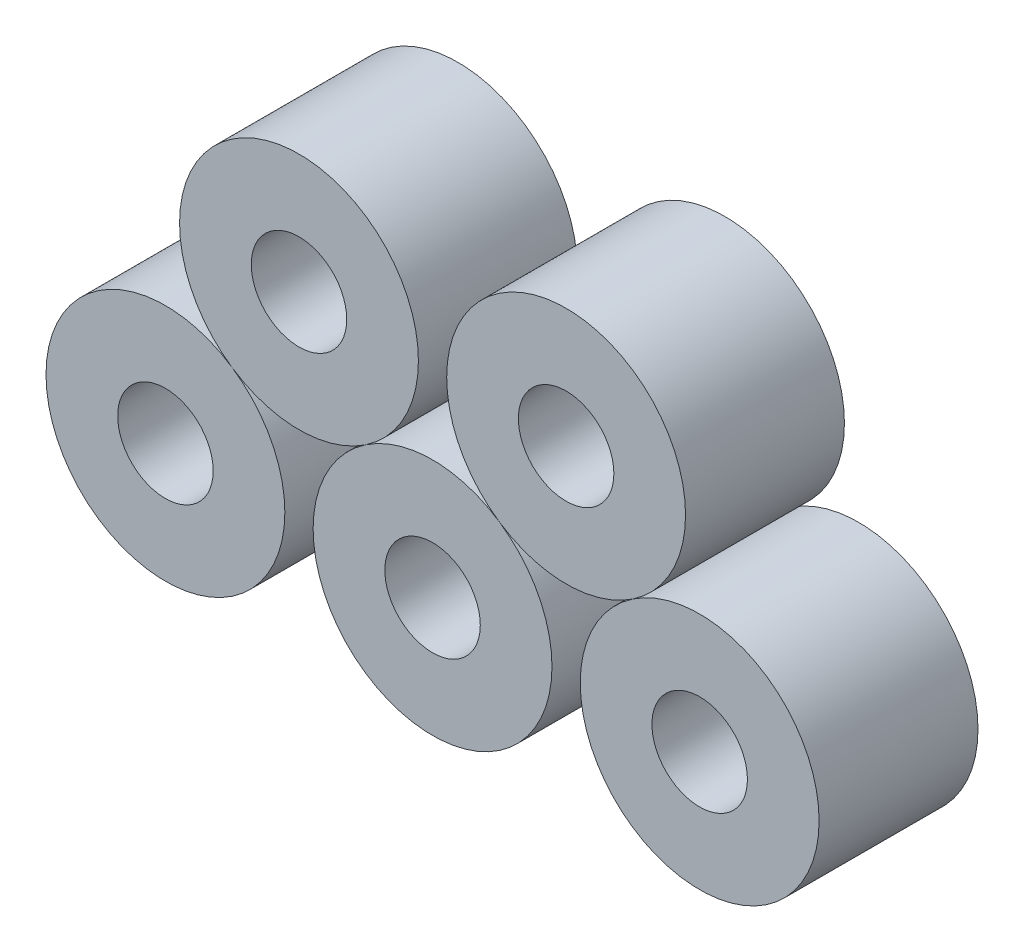
ISO-10303-21;
HEADER;
FILE_DESCRIPTION(('STEP AP214'),'2;1');
FILE_NAME('part.step','',(''),(''),'','','');
FILE_SCHEMA(('AUTOMOTIVE_DESIGN { 1 0 10303 214 1 1 1 1 }'));
ENDSEC;
DATA;
#1=APPLICATION_CONTEXT('core data for automotive mechanical design processes');
#2=APPLICATION_PROTOCOL_DEFINITION('international standard','automotive_design',2000,#1);
#3=PRODUCT_CONTEXT('',#1,'mechanical');
#4=PRODUCT('Part','Part','',(#3));
#5=PRODUCT_RELATED_PRODUCT_CATEGORY('part','',(#4));
#6=PRODUCT_DEFINITION_FORMATION('','',#4);
#7=PRODUCT_DEFINITION_CONTEXT('part definition',#1,'design');
#8=PRODUCT_DEFINITION('design','',#6,#7);
#9=PRODUCT_DEFINITION_SHAPE('','',#8);
#10=(LENGTH_UNIT() NAMED_UNIT(*) SI_UNIT(.MILLI.,.METRE.));
#11=(NAMED_UNIT(*) PLANE_ANGLE_UNIT() SI_UNIT($,.RADIAN.));
#12=(NAMED_UNIT(*) SI_UNIT($,.STERADIAN.) SOLID_ANGLE_UNIT());
#13=UNCERTAINTY_MEASURE_WITH_UNIT(LENGTH_MEASURE(1.E-05),#10,'distance_accuracy_value','');
#14=(GEOMETRIC_REPRESENTATION_CONTEXT(3) GLOBAL_UNCERTAINTY_ASSIGNED_CONTEXT((#13)) GLOBAL_UNIT_ASSIGNED_CONTEXT((#10,
#11,#12)) REPRESENTATION_CONTEXT('',''));
#15=CARTESIAN_POINT('',(0.,0.,0.));
#16=DIRECTION('',(0.,0.,1.));
#17=DIRECTION('',(1.,0.,0.));
#18=AXIS2_PLACEMENT_3D('',#15,#16,#17);
#19=CARTESIAN_POINT('',(0.,0.,1268.));
#20=DIRECTION('',(0.,0.,1.));
#21=DIRECTION('',(1.,0.,0.));
#22=AXIS2_PLACEMENT_3D('',#19,#20,#21);
#23=PLANE('',#22);
#24=CARTESIAN_POINT('',(0.,0.,1268.));
#25=DIRECTION('',(0.,0.,1.));
#26=DIRECTION('',(1.,0.,0.));
#27=AXIS2_PLACEMENT_3D('',#24,#25,#26);
#28=CIRCLE('',#27,953.);
#29=CARTESIAN_POINT('',(953.,0.,1268.));
#30=VERTEX_POINT('',#29);
#31=EDGE_CURVE('E112',#30,#30,#28,.T.);
#32=ORIENTED_EDGE('',*,*,#31,.T.);
#33=EDGE_LOOP('',(#32));
#34=FACE_BOUND('',#33,.T.);
#35=CARTESIAN_POINT('',(0.,0.,1268.));
#36=DIRECTION('',(0.,0.,1.));
#37=DIRECTION('',(1.,0.,0.));
#38=AXIS2_PLACEMENT_3D('',#35,#36,#37);
#39=CIRCLE('',#38,381.);
#40=CARTESIAN_POINT('',(381.,0.,1268.));
#41=VERTEX_POINT('',#40);
#42=EDGE_CURVE('E103',#41,#41,#39,.T.);
#43=ORIENTED_EDGE('',*,*,#42,.F.);
#44=EDGE_LOOP('',(#43));
#45=FACE_BOUND('',#44,.T.);
#46=ADVANCED_FACE('F99',(#34,#45),#23,.T.);
#47=CARTESIAN_POINT('',(0.,0.,0.));
#48=DIRECTION('',(0.,0.,1.));
#49=DIRECTION('',(1.,0.,0.));
#50=AXIS2_PLACEMENT_3D('',#47,#48,#49);
#51=PLANE('',#50);
#52=CARTESIAN_POINT('',(0.,0.,0.));
#53=DIRECTION('',(0.,0.,1.));
#54=DIRECTION('',(1.,0.,0.));
#55=AXIS2_PLACEMENT_3D('',#52,#53,#54);
#56=CIRCLE('',#55,953.);
#57=CARTESIAN_POINT('',(953.,0.,0.));
#58=VERTEX_POINT('',#57);
#59=EDGE_CURVE('E110',#58,#58,#56,.T.);
#60=ORIENTED_EDGE('',*,*,#59,.F.);
#61=EDGE_LOOP('',(#60));
#62=FACE_BOUND('',#61,.T.);
#63=CARTESIAN_POINT('',(0.,0.,0.));
#64=DIRECTION('',(0.,0.,1.));
#65=DIRECTION('',(1.,0.,0.));
#66=AXIS2_PLACEMENT_3D('',#63,#64,#65);
#67=CIRCLE('',#66,381.);
#68=CARTESIAN_POINT('',(381.,0.,0.));
#69=VERTEX_POINT('',#68);
#70=EDGE_CURVE('E12',#69,#69,#67,.T.);
#71=ORIENTED_EDGE('',*,*,#70,.T.);
#72=EDGE_LOOP('',(#71));
#73=FACE_BOUND('',#72,.T.);
#74=ADVANCED_FACE('F121',(#62,#73),#51,.F.);
#75=CARTESIAN_POINT('',(0.,0.,1268.));
#76=DIRECTION('',(0.,0.,-1.));
#77=DIRECTION('',(-1.,0.,0.));
#78=AXIS2_PLACEMENT_3D('',#75,#76,#77);
#79=CYLINDRICAL_SURFACE('',#78,953.);
#80=ORIENTED_EDGE('',*,*,#59,.T.);
#81=EDGE_LOOP('',(#80));
#82=FACE_BOUND('',#81,.T.);
#83=ORIENTED_EDGE('',*,*,#31,.F.);
#84=EDGE_LOOP('',(#83));
#85=FACE_BOUND('',#84,.T.);
#86=ADVANCED_FACE('F118',(#82,#85),#79,.T.);
#87=CARTESIAN_POINT('',(0.,0.,1268.));
#88=DIRECTION('',(0.,0.,-1.));
#89=DIRECTION('',(-1.,0.,0.));
#90=AXIS2_PLACEMENT_3D('',#87,#88,#89);
#91=CYLINDRICAL_SURFACE('',#90,381.);
#92=ORIENTED_EDGE('',*,*,#42,.T.);
#93=EDGE_LOOP('',(#92));
#94=FACE_BOUND('',#93,.T.);
#95=ORIENTED_EDGE('',*,*,#70,.F.);
#96=EDGE_LOOP('',(#95));
#97=FACE_BOUND('',#96,.T.);
#98=ADVANCED_FACE('F101',(#94,#97),#91,.F.);
#99=CLOSED_SHELL('',(#46,#74,#86,#98));
#100=MANIFOLD_SOLID_BREP('B2',#99);
#101=CARTESIAN_POINT('',(1065.82167401524,1580.14561328991,1268.));
#102=DIRECTION('',(0.,0.,-1.));
#103=DIRECTION('',(-1.,0.,0.));
#104=AXIS2_PLACEMENT_3D('',#101,#102,#103);
#105=CYLINDRICAL_SURFACE('',#104,953.);
#106=CARTESIAN_POINT('',(1065.82167401524,1580.14561328991,0.));
#107=DIRECTION('',(0.,0.,1.));
#108=DIRECTION('',(1.,0.,0.));
#109=AXIS2_PLACEMENT_3D('',#106,#107,#108);
#110=CIRCLE('',#109,953.);
#111=CARTESIAN_POINT('',(2018.82167401524,1580.14561328991,0.));
#112=VERTEX_POINT('',#111);
#113=EDGE_CURVE('E179',#112,#112,#110,.T.);
#114=ORIENTED_EDGE('',*,*,#113,.T.);
#115=EDGE_LOOP('',(#114));
#116=FACE_BOUND('',#115,.T.);
#117=CARTESIAN_POINT('',(1065.82167401524,1580.14561328991,1268.));
#118=DIRECTION('',(0.,0.,1.));
#119=DIRECTION('',(1.,0.,0.));
#120=AXIS2_PLACEMENT_3D('',#117,#118,#119);
#121=CIRCLE('',#120,953.);
#122=CARTESIAN_POINT('',(2018.82167401524,1580.14561328991,1268.));
#123=VERTEX_POINT('',#122);
#124=EDGE_CURVE('E181',#123,#123,#121,.T.);
#125=ORIENTED_EDGE('',*,*,#124,.F.);
#126=EDGE_LOOP('',(#125));
#127=FACE_BOUND('',#126,.T.);
#128=ADVANCED_FACE('F168',(#116,#127),#105,.T.);
#129=CARTESIAN_POINT('',(1065.82167401524,1580.14561328991,1268.));
#130=DIRECTION('',(0.,0.,1.));
#131=DIRECTION('',(1.,0.,0.));
#132=AXIS2_PLACEMENT_3D('',#129,#130,#131);
#133=PLANE('',#132);
#134=ORIENTED_EDGE('',*,*,#124,.T.);
#135=EDGE_LOOP('',(#134));
#136=FACE_BOUND('',#135,.T.);
#137=CARTESIAN_POINT('',(1065.82167401524,1580.14561328991,1268.));
#138=DIRECTION('',(0.,0.,1.));
#139=DIRECTION('',(1.,0.,0.));
#140=AXIS2_PLACEMENT_3D('',#137,#138,#139);
#141=CIRCLE('',#140,381.);
#142=CARTESIAN_POINT('',(1446.82167401524,1580.14561328991,1268.));
#143=VERTEX_POINT('',#142);
#144=EDGE_CURVE('E172',#143,#143,#141,.T.);
#145=ORIENTED_EDGE('',*,*,#144,.F.);
#146=EDGE_LOOP('',(#145));
#147=FACE_BOUND('',#146,.T.);
#148=ADVANCED_FACE('F191',(#136,#147),#133,.T.);
#149=CARTESIAN_POINT('',(1065.82167401524,1580.14561328991,0.));
#150=DIRECTION('',(0.,0.,1.));
#151=DIRECTION('',(1.,0.,0.));
#152=AXIS2_PLACEMENT_3D('',#149,#150,#151);
#153=PLANE('',#152);
#154=ORIENTED_EDGE('',*,*,#113,.F.);
#155=EDGE_LOOP('',(#154));
#156=FACE_BOUND('',#155,.T.);
#157=CARTESIAN_POINT('',(1065.82167401524,1580.14561328991,0.));
#158=DIRECTION('',(0.,0.,1.));
#159=DIRECTION('',(1.,0.,0.));
#160=AXIS2_PLACEMENT_3D('',#157,#158,#159);
#161=CIRCLE('',#160,381.);
#162=CARTESIAN_POINT('',(1446.82167401524,1580.14561328991,0.));
#163=VERTEX_POINT('',#162);
#164=EDGE_CURVE('E98',#163,#163,#161,.T.);
#165=ORIENTED_EDGE('',*,*,#164,.T.);
#166=EDGE_LOOP('',(#165));
#167=FACE_BOUND('',#166,.T.);
#168=ADVANCED_FACE('F189',(#156,#167),#153,.F.);
#169=CARTESIAN_POINT('',(1065.82167401524,1580.14561328991,1268.));
#170=DIRECTION('',(0.,0.,-1.));
#171=DIRECTION('',(-1.,0.,0.));
#172=AXIS2_PLACEMENT_3D('',#169,#170,#171);
#173=CYLINDRICAL_SURFACE('',#172,381.);
#174=ORIENTED_EDGE('',*,*,#144,.T.);
#175=EDGE_LOOP('',(#174));
#176=FACE_BOUND('',#175,.T.);
#177=ORIENTED_EDGE('',*,*,#164,.F.);
#178=EDGE_LOOP('',(#177));
#179=FACE_BOUND('',#178,.T.);
#180=ADVANCED_FACE('F170',(#176,#179),#173,.F.);
#181=CLOSED_SHELL('',(#128,#148,#168,#180));
#182=MANIFOLD_SOLID_BREP('B7',#181);
#183=CARTESIAN_POINT('',(2131.64334803048,0.,1268.));
#184=DIRECTION('',(0.,0.,-1.));
#185=DIRECTION('',(-1.,0.,0.));
#186=AXIS2_PLACEMENT_3D('',#183,#184,#185);
#187=CYLINDRICAL_SURFACE('',#186,953.);
#188=CARTESIAN_POINT('',(2131.64334803048,0.,0.));
#189=DIRECTION('',(0.,0.,1.));
#190=DIRECTION('',(1.,0.,0.));
#191=AXIS2_PLACEMENT_3D('',#188,#189,#190);
#192=CIRCLE('',#191,953.);
#193=CARTESIAN_POINT('',(3084.64334803048,0.,0.));
#194=VERTEX_POINT('',#193);
#195=EDGE_CURVE('E248',#194,#194,#192,.T.);
#196=ORIENTED_EDGE('',*,*,#195,.T.);
#197=EDGE_LOOP('',(#196));
#198=FACE_BOUND('',#197,.T.);
#199=CARTESIAN_POINT('',(2131.64334803048,0.,1268.));
#200=DIRECTION('',(0.,0.,1.));
#201=DIRECTION('',(1.,0.,0.));
#202=AXIS2_PLACEMENT_3D('',#199,#200,#201);
#203=CIRCLE('',#202,953.);
#204=CARTESIAN_POINT('',(3084.64334803048,0.,1268.));
#205=VERTEX_POINT('',#204);
#206=EDGE_CURVE('E250',#205,#205,#203,.T.);
#207=ORIENTED_EDGE('',*,*,#206,.F.);
#208=EDGE_LOOP('',(#207));
#209=FACE_BOUND('',#208,.T.);
#210=ADVANCED_FACE('F237',(#198,#209),#187,.T.);
#211=CARTESIAN_POINT('',(2131.64334803048,0.,1268.));
#212=DIRECTION('',(0.,0.,1.));
#213=DIRECTION('',(1.,0.,0.));
#214=AXIS2_PLACEMENT_3D('',#211,#212,#213);
#215=PLANE('',#214);
#216=ORIENTED_EDGE('',*,*,#206,.T.);
#217=EDGE_LOOP('',(#216));
#218=FACE_BOUND('',#217,.T.);
#219=CARTESIAN_POINT('',(2131.64334803048,0.,1268.));
#220=DIRECTION('',(0.,0.,1.));
#221=DIRECTION('',(1.,0.,0.));
#222=AXIS2_PLACEMENT_3D('',#219,#220,#221);
#223=CIRCLE('',#222,381.);
#224=CARTESIAN_POINT('',(2512.64334803048,0.,1268.));
#225=VERTEX_POINT('',#224);
#226=EDGE_CURVE('E241',#225,#225,#223,.T.);
#227=ORIENTED_EDGE('',*,*,#226,.F.);
#228=EDGE_LOOP('',(#227));
#229=FACE_BOUND('',#228,.T.);
#230=ADVANCED_FACE('F260',(#218,#229),#215,.T.);
#231=CARTESIAN_POINT('',(2131.64334803048,0.,0.));
#232=DIRECTION('',(0.,0.,1.));
#233=DIRECTION('',(1.,0.,0.));
#234=AXIS2_PLACEMENT_3D('',#231,#232,#233);
#235=PLANE('',#234);
#236=ORIENTED_EDGE('',*,*,#195,.F.);
#237=EDGE_LOOP('',(#236));
#238=FACE_BOUND('',#237,.T.);
#239=CARTESIAN_POINT('',(2131.64334803048,0.,0.));
#240=DIRECTION('',(0.,0.,1.));
#241=DIRECTION('',(1.,0.,0.));
#242=AXIS2_PLACEMENT_3D('',#239,#240,#241);
#243=CIRCLE('',#242,381.);
#244=CARTESIAN_POINT('',(2512.64334803048,0.,0.));
#245=VERTEX_POINT('',#244);
#246=EDGE_CURVE('E167',#245,#245,#243,.T.);
#247=ORIENTED_EDGE('',*,*,#246,.T.);
#248=EDGE_LOOP('',(#247));
#249=FACE_BOUND('',#248,.T.);
#250=ADVANCED_FACE('F258',(#238,#249),#235,.F.);
#251=CARTESIAN_POINT('',(2131.64334803048,0.,1268.));
#252=DIRECTION('',(0.,0.,-1.));
#253=DIRECTION('',(-1.,0.,0.));
#254=AXIS2_PLACEMENT_3D('',#251,#252,#253);
#255=CYLINDRICAL_SURFACE('',#254,381.);
#256=ORIENTED_EDGE('',*,*,#226,.T.);
#257=EDGE_LOOP('',(#256));
#258=FACE_BOUND('',#257,.T.);
#259=ORIENTED_EDGE('',*,*,#246,.F.);
#260=EDGE_LOOP('',(#259));
#261=FACE_BOUND('',#260,.T.);
#262=ADVANCED_FACE('F239',(#258,#261),#255,.F.);
#263=CLOSED_SHELL('',(#210,#230,#250,#262));
#264=MANIFOLD_SOLID_BREP('B93',#263);
#265=CARTESIAN_POINT('',(4263.28669606096,0.,1268.));
#266=DIRECTION('',(0.,0.,1.));
#267=DIRECTION('',(1.,0.,0.));
#268=AXIS2_PLACEMENT_3D('',#265,#266,#267);
#269=PLANE('',#268);
#270=CARTESIAN_POINT('',(4263.28669606096,0.,1268.));
#271=DIRECTION('',(0.,0.,1.));
#272=DIRECTION('',(1.,0.,0.));
#273=AXIS2_PLACEMENT_3D('',#270,#271,#272);
#274=CIRCLE('',#273,953.);
#275=CARTESIAN_POINT('',(5216.28669606096,0.,1268.));
#276=VERTEX_POINT('',#275);
#277=EDGE_CURVE('E318',#276,#276,#274,.T.);
#278=ORIENTED_EDGE('',*,*,#277,.T.);
#279=EDGE_LOOP('',(#278));
#280=FACE_BOUND('',#279,.T.);
#281=CARTESIAN_POINT('',(4263.28669606096,0.,1268.));
#282=DIRECTION('',(0.,0.,1.));
#283=DIRECTION('',(1.,0.,0.));
#284=AXIS2_PLACEMENT_3D('',#281,#282,#283);
#285=CIRCLE('',#284,381.);
#286=CARTESIAN_POINT('',(4644.28669606096,0.,1268.));
#287=VERTEX_POINT('',#286);
#288=EDGE_CURVE('E309',#287,#287,#285,.T.);
#289=ORIENTED_EDGE('',*,*,#288,.F.);
#290=EDGE_LOOP('',(#289));
#291=FACE_BOUND('',#290,.T.);
#292=ADVANCED_FACE('F305',(#280,#291),#269,.T.);
#293=CARTESIAN_POINT('',(4263.28669606096,0.,0.));
#294=DIRECTION('',(0.,0.,1.));
#295=DIRECTION('',(1.,0.,0.));
#296=AXIS2_PLACEMENT_3D('',#293,#294,#295);
#297=PLANE('',#296);
#298=CARTESIAN_POINT('',(4263.28669606096,0.,0.));
#299=DIRECTION('',(0.,0.,1.));
#300=DIRECTION('',(1.,0.,0.));
#301=AXIS2_PLACEMENT_3D('',#298,#299,#300);
#302=CIRCLE('',#301,953.);
#303=CARTESIAN_POINT('',(5216.28669606096,0.,0.));
#304=VERTEX_POINT('',#303);
#305=EDGE_CURVE('E316',#304,#304,#302,.T.);
#306=ORIENTED_EDGE('',*,*,#305,.F.);
#307=EDGE_LOOP('',(#306));
#308=FACE_BOUND('',#307,.T.);
#309=CARTESIAN_POINT('',(4263.28669606096,0.,0.));
#310=DIRECTION('',(0.,0.,1.));
#311=DIRECTION('',(1.,0.,0.));
#312=AXIS2_PLACEMENT_3D('',#309,#310,#311);
#313=CIRCLE('',#312,381.);
#314=CARTESIAN_POINT('',(4644.28669606096,0.,0.));
#315=VERTEX_POINT('',#314);
#316=EDGE_CURVE('E236',#315,#315,#313,.T.);
#317=ORIENTED_EDGE('',*,*,#316,.T.);
#318=EDGE_LOOP('',(#317));
#319=FACE_BOUND('',#318,.T.);
#320=ADVANCED_FACE('F327',(#308,#319),#297,.F.);
#321=CARTESIAN_POINT('',(4263.28669606096,0.,1268.));
#322=DIRECTION('',(0.,0.,-1.));
#323=DIRECTION('',(-1.,0.,0.));
#324=AXIS2_PLACEMENT_3D('',#321,#322,#323);
#325=CYLINDRICAL_SURFACE('',#324,953.);
#326=ORIENTED_EDGE('',*,*,#305,.T.);
#327=EDGE_LOOP('',(#326));
#328=FACE_BOUND('',#327,.T.);
#329=ORIENTED_EDGE('',*,*,#277,.F.);
#330=EDGE_LOOP('',(#329));
#331=FACE_BOUND('',#330,.T.);
#332=ADVANCED_FACE('F324',(#328,#331),#325,.T.);
#333=CARTESIAN_POINT('',(4263.28669606096,0.,1268.));
#334=DIRECTION('',(0.,0.,-1.));
#335=DIRECTION('',(-1.,0.,0.));
#336=AXIS2_PLACEMENT_3D('',#333,#334,#335);
#337=CYLINDRICAL_SURFACE('',#336,381.);
#338=ORIENTED_EDGE('',*,*,#288,.T.);
#339=EDGE_LOOP('',(#338));
#340=FACE_BOUND('',#339,.T.);
#341=ORIENTED_EDGE('',*,*,#316,.F.);
#342=EDGE_LOOP('',(#341));
#343=FACE_BOUND('',#342,.T.);
#344=ADVANCED_FACE('F307',(#340,#343),#337,.F.);
#345=CLOSED_SHELL('',(#292,#320,#332,#344));
#346=MANIFOLD_SOLID_BREP('B162',#345);
#347=CARTESIAN_POINT('',(3197.46502204572,1580.14561328991,1268.));
#348=DIRECTION('',(0.,0.,-1.));
#349=DIRECTION('',(-1.,0.,0.));
#350=AXIS2_PLACEMENT_3D('',#347,#348,#349);
#351=CYLINDRICAL_SURFACE('',#350,952.999999999999);
#352=CARTESIAN_POINT('',(3197.46502204572,1580.14561328991,0.));
#353=DIRECTION('',(0.,0.,1.));
#354=DIRECTION('',(1.,0.,0.));
#355=AXIS2_PLACEMENT_3D('',#352,#353,#354);
#356=CIRCLE('',#355,952.999999999999);
#357=CARTESIAN_POINT('',(4150.46502204572,1580.14561328991,0.));
#358=VERTEX_POINT('',#357);
#359=EDGE_CURVE('E369',#358,#358,#356,.T.);
#360=ORIENTED_EDGE('',*,*,#359,.T.);
#361=EDGE_LOOP('',(#360));
#362=FACE_BOUND('',#361,.T.);
#363=CARTESIAN_POINT('',(3197.46502204572,1580.14561328991,1268.));
#364=DIRECTION('',(0.,0.,1.));
#365=DIRECTION('',(1.,0.,0.));
#366=AXIS2_PLACEMENT_3D('',#363,#364,#365);
#367=CIRCLE('',#366,952.999999999999);
#368=CARTESIAN_POINT('',(4150.46502204572,1580.14561328991,1268.));
#369=VERTEX_POINT('',#368);
#370=EDGE_CURVE('E304',#369,#369,#367,.T.);
#371=ORIENTED_EDGE('',*,*,#370,.F.);
#372=EDGE_LOOP('',(#371));
#373=FACE_BOUND('',#372,.T.);
#374=ADVANCED_FACE('F366',(#362,#373),#351,.T.);
#375=CARTESIAN_POINT('',(3197.46502204572,1580.14561328991,1268.));
#376=DIRECTION('',(0.,0.,1.));
#377=DIRECTION('',(1.,0.,0.));
#378=AXIS2_PLACEMENT_3D('',#375,#376,#377);
#379=PLANE('',#378);
#380=ORIENTED_EDGE('',*,*,#370,.T.);
#381=EDGE_LOOP('',(#380));
#382=FACE_BOUND('',#381,.T.);
#383=CARTESIAN_POINT('',(3197.46502204572,1580.14561328991,1268.));
#384=DIRECTION('',(0.,0.,1.));
#385=DIRECTION('',(1.,0.,0.));
#386=AXIS2_PLACEMENT_3D('',#383,#384,#385);
#387=CIRCLE('',#386,381.);
#388=CARTESIAN_POINT('',(3578.46502204572,1580.14561328991,1268.));
#389=VERTEX_POINT('',#388);
#390=EDGE_CURVE('E376',#389,#389,#387,.T.);
#391=ORIENTED_EDGE('',*,*,#390,.F.);
#392=EDGE_LOOP('',(#391));
#393=FACE_BOUND('',#392,.T.);
#394=ADVANCED_FACE('F387',(#382,#393),#379,.T.);
#395=CARTESIAN_POINT('',(3197.46502204572,1580.14561328991,0.));
#396=DIRECTION('',(0.,0.,1.));
#397=DIRECTION('',(1.,0.,0.));
#398=AXIS2_PLACEMENT_3D('',#395,#396,#397);
#399=PLANE('',#398);
#400=ORIENTED_EDGE('',*,*,#359,.F.);
#401=EDGE_LOOP('',(#400));
#402=FACE_BOUND('',#401,.T.);
#403=CARTESIAN_POINT('',(3197.46502204572,1580.14561328991,0.));
#404=DIRECTION('',(0.,0.,1.));
#405=DIRECTION('',(1.,0.,0.));
#406=AXIS2_PLACEMENT_3D('',#403,#404,#405);
#407=CIRCLE('',#406,381.);
#408=CARTESIAN_POINT('',(3578.46502204572,1580.14561328991,0.));
#409=VERTEX_POINT('',#408);
#410=EDGE_CURVE('E378',#409,#409,#407,.T.);
#411=ORIENTED_EDGE('',*,*,#410,.T.);
#412=EDGE_LOOP('',(#411));
#413=FACE_BOUND('',#412,.T.);
#414=ADVANCED_FACE('F389',(#402,#413),#399,.F.);
#415=CARTESIAN_POINT('',(3197.46502204572,1580.14561328991,1268.));
#416=DIRECTION('',(0.,0.,-1.));
#417=DIRECTION('',(-1.,0.,0.));
#418=AXIS2_PLACEMENT_3D('',#415,#416,#417);
#419=CYLINDRICAL_SURFACE('',#418,381.);
#420=ORIENTED_EDGE('',*,*,#390,.T.);
#421=EDGE_LOOP('',(#420));
#422=FACE_BOUND('',#421,.T.);
#423=ORIENTED_EDGE('',*,*,#410,.F.);
#424=EDGE_LOOP('',(#423));
#425=FACE_BOUND('',#424,.T.);
#426=ADVANCED_FACE('F384',(#422,#425),#419,.F.);
#427=CLOSED_SHELL('',(#374,#394,#414,#426));
#428=MANIFOLD_SOLID_BREP('B231',#427);
#429=ADVANCED_BREP_SHAPE_REPRESENTATION('',(#18,#100,#182,#264,#346,#428),#14);
#430=SHAPE_DEFINITION_REPRESENTATION(#9,#429);
ENDSEC;
END-ISO-10303-21;
